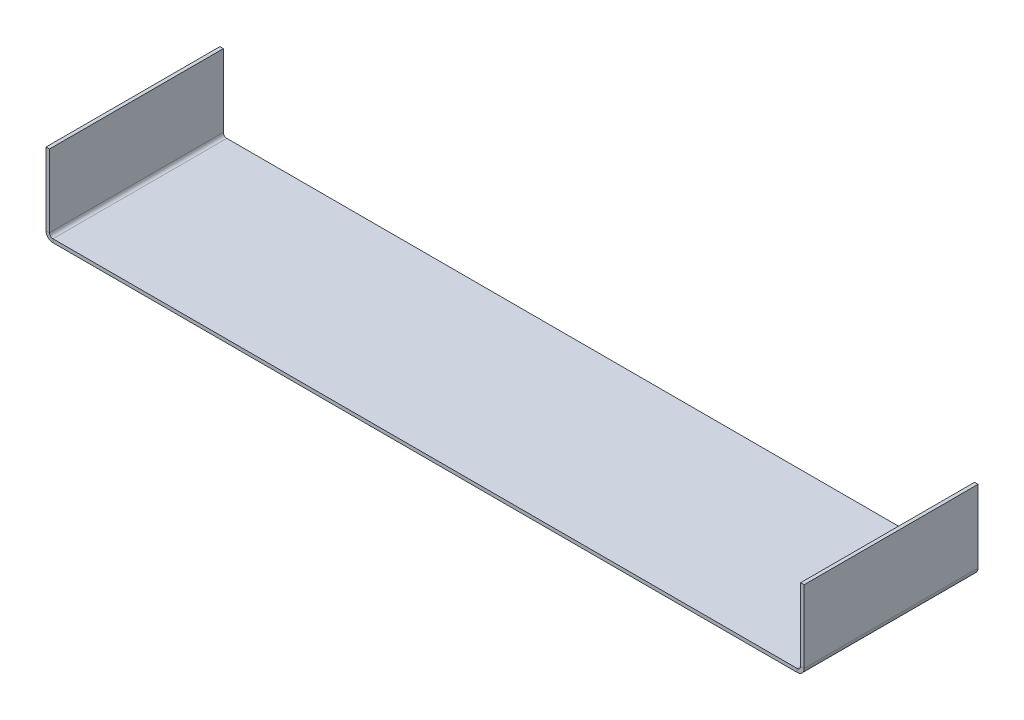
ISO-10303-21;
HEADER;
FILE_DESCRIPTION(('STEP AP214'),'2;1');
FILE_NAME('part.step','',(''),(''),'','','');
FILE_SCHEMA(('AUTOMOTIVE_DESIGN { 1 0 10303 214 1 1 1 1 }'));
ENDSEC;
DATA;
#1=APPLICATION_CONTEXT('core data for automotive mechanical design processes');
#2=APPLICATION_PROTOCOL_DEFINITION('international standard','automotive_design',2000,#1);
#3=PRODUCT_CONTEXT('',#1,'mechanical');
#4=PRODUCT('Part','Part','',(#3));
#5=PRODUCT_RELATED_PRODUCT_CATEGORY('part','',(#4));
#6=PRODUCT_DEFINITION_FORMATION('','',#4);
#7=PRODUCT_DEFINITION_CONTEXT('part definition',#1,'design');
#8=PRODUCT_DEFINITION('design','',#6,#7);
#9=PRODUCT_DEFINITION_SHAPE('','',#8);
#10=(LENGTH_UNIT() NAMED_UNIT(*) SI_UNIT(.MILLI.,.METRE.));
#11=(NAMED_UNIT(*) PLANE_ANGLE_UNIT() SI_UNIT($,.RADIAN.));
#12=(NAMED_UNIT(*) SI_UNIT($,.STERADIAN.) SOLID_ANGLE_UNIT());
#13=UNCERTAINTY_MEASURE_WITH_UNIT(LENGTH_MEASURE(1.E-05),#10,'distance_accuracy_value','');
#14=(GEOMETRIC_REPRESENTATION_CONTEXT(3) GLOBAL_UNCERTAINTY_ASSIGNED_CONTEXT((#13)) GLOBAL_UNIT_ASSIGNED_CONTEXT((#10,
#11,#12)) REPRESENTATION_CONTEXT('',''));
#15=CARTESIAN_POINT('',(0.,0.,0.));
#16=DIRECTION('',(0.,0.,1.));
#17=DIRECTION('',(1.,0.,0.));
#18=AXIS2_PLACEMENT_3D('',#15,#16,#17);
#19=CARTESIAN_POINT('',(0.,-41.7,100.));
#20=DIRECTION('',(0.,0.,1.));
#21=DIRECTION('',(1.,0.,0.));
#22=AXIS2_PLACEMENT_3D('',#19,#20,#21);
#23=PLANE('',#22);
#24=DIRECTION('',(1.,0.,0.));
#25=VECTOR('',#24,1.);
#26=CARTESIAN_POINT('',(0.,-41.7,100.));
#27=LINE('',#26,#25);
#28=CARTESIAN_POINT('',(0.,-41.7,100.));
#29=VERTEX_POINT('',#28);
#30=CARTESIAN_POINT('',(2.00000000000001,-41.7,100.));
#31=VERTEX_POINT('',#30);
#32=EDGE_CURVE('E11',#29,#31,#27,.T.);
#33=ORIENTED_EDGE('',*,*,#32,.F.);
#34=CARTESIAN_POINT('',(4.00000000000001,-41.7,100.));
#35=DIRECTION('',(0.,0.,-1.));
#36=DIRECTION('',(-1.,0.,0.));
#37=AXIS2_PLACEMENT_3D('',#34,#35,#36);
#38=CIRCLE('',#37,4.);
#39=CARTESIAN_POINT('',(4.00000000000001,-45.7,100.));
#40=VERTEX_POINT('',#39);
#41=EDGE_CURVE('E149',#29,#40,#38,.F.);
#42=ORIENTED_EDGE('',*,*,#41,.T.);
#43=DIRECTION('',(0.,-1.,0.));
#44=VECTOR('',#43,1.);
#45=CARTESIAN_POINT('',(4.00000000000001,-43.7,100.));
#46=LINE('',#45,#44);
#47=CARTESIAN_POINT('',(4.00000000000001,-43.7,100.));
#48=VERTEX_POINT('',#47);
#49=EDGE_CURVE('E47',#48,#40,#46,.T.);
#50=ORIENTED_EDGE('',*,*,#49,.F.);
#51=CARTESIAN_POINT('',(4.00000000000001,-41.7,100.));
#52=DIRECTION('',(0.,0.,1.));
#53=DIRECTION('',(1.,0.,0.));
#54=AXIS2_PLACEMENT_3D('',#51,#52,#53);
#55=CIRCLE('',#54,2.);
#56=EDGE_CURVE('E243',#31,#48,#55,.T.);
#57=ORIENTED_EDGE('',*,*,#56,.F.);
#58=EDGE_LOOP('',(#33,#42,#50,#57));
#59=FACE_BOUND('',#58,.T.);
#60=ADVANCED_FACE('F39',(#59),#23,.T.);
#61=CARTESIAN_POINT('',(4.00000000000001,-43.7,100.));
#62=DIRECTION('',(0.,0.,1.));
#63=DIRECTION('',(1.,0.,0.));
#64=AXIS2_PLACEMENT_3D('',#61,#62,#63);
#65=PLANE('',#64);
#66=DIRECTION('',(0.,-1.,0.));
#67=VECTOR('',#66,1.);
#68=CARTESIAN_POINT('',(0.,0.,100.));
#69=LINE('',#68,#67);
#70=CARTESIAN_POINT('',(0.,0.,100.));
#71=VERTEX_POINT('',#70);
#72=EDGE_CURVE('E154',#71,#29,#69,.T.);
#73=ORIENTED_EDGE('',*,*,#72,.T.);
#74=ORIENTED_EDGE('',*,*,#32,.T.);
#75=DIRECTION('',(0.,-1.,0.));
#76=VECTOR('',#75,1.);
#77=CARTESIAN_POINT('',(2.,0.,100.));
#78=LINE('',#77,#76);
#79=CARTESIAN_POINT('',(2.,0.,100.));
#80=VERTEX_POINT('',#79);
#81=EDGE_CURVE('E256',#80,#31,#78,.T.);
#82=ORIENTED_EDGE('',*,*,#81,.F.);
#83=DIRECTION('',(1.,0.,0.));
#84=VECTOR('',#83,1.);
#85=CARTESIAN_POINT('',(0.,0.,100.));
#86=LINE('',#85,#84);
#87=EDGE_CURVE('E258',#71,#80,#86,.T.);
#88=ORIENTED_EDGE('',*,*,#87,.F.);
#89=EDGE_LOOP('',(#73,#74,#82,#88));
#90=FACE_BOUND('',#89,.T.);
#91=ADVANCED_FACE('F269',(#90),#65,.T.);
#92=CARTESIAN_POINT('',(4.00000000000001,-45.7,0.));
#93=DIRECTION('',(0.,0.,-1.));
#94=DIRECTION('',(-1.,0.,0.));
#95=AXIS2_PLACEMENT_3D('',#92,#93,#94);
#96=PLANE('',#95);
#97=DIRECTION('',(0.,1.,0.));
#98=VECTOR('',#97,1.);
#99=CARTESIAN_POINT('',(4.00000000000001,-45.7,0.));
#100=LINE('',#99,#98);
#101=CARTESIAN_POINT('',(4.00000000000001,-45.7,0.));
#102=VERTEX_POINT('',#101);
#103=CARTESIAN_POINT('',(4.00000000000001,-43.7,0.));
#104=VERTEX_POINT('',#103);
#105=EDGE_CURVE('E147',#102,#104,#100,.T.);
#106=ORIENTED_EDGE('',*,*,#105,.F.);
#107=CARTESIAN_POINT('',(4.00000000000001,-41.7,0.));
#108=DIRECTION('',(0.,0.,-1.));
#109=DIRECTION('',(-1.,0.,0.));
#110=AXIS2_PLACEMENT_3D('',#107,#108,#109);
#111=CIRCLE('',#110,4.);
#112=CARTESIAN_POINT('',(0.,-41.7,0.));
#113=VERTEX_POINT('',#112);
#114=EDGE_CURVE('E161',#113,#102,#111,.F.);
#115=ORIENTED_EDGE('',*,*,#114,.F.);
#116=DIRECTION('',(-1.,0.,0.));
#117=VECTOR('',#116,1.);
#118=CARTESIAN_POINT('',(2.00000000000001,-41.7,0.));
#119=LINE('',#118,#117);
#120=CARTESIAN_POINT('',(2.00000000000001,-41.7,0.));
#121=VERTEX_POINT('',#120);
#122=EDGE_CURVE('E234',#121,#113,#119,.T.);
#123=ORIENTED_EDGE('',*,*,#122,.F.);
#124=CARTESIAN_POINT('',(4.00000000000001,-41.7,0.));
#125=DIRECTION('',(0.,0.,1.));
#126=DIRECTION('',(1.,0.,0.));
#127=AXIS2_PLACEMENT_3D('',#124,#125,#126);
#128=CIRCLE('',#127,2.);
#129=EDGE_CURVE('E188',#121,#104,#128,.T.);
#130=ORIENTED_EDGE('',*,*,#129,.T.);
#131=EDGE_LOOP('',(#106,#115,#123,#130));
#132=FACE_BOUND('',#131,.T.);
#133=ADVANCED_FACE('F248',(#132),#96,.T.);
#134=CARTESIAN_POINT('',(2.00000000000001,-41.7,0.));
#135=DIRECTION('',(0.,0.,-1.));
#136=DIRECTION('',(-1.,0.,0.));
#137=AXIS2_PLACEMENT_3D('',#134,#135,#136);
#138=PLANE('',#137);
#139=DIRECTION('',(1.,0.,0.));
#140=VECTOR('',#139,1.);
#141=CARTESIAN_POINT('',(0.,-45.7,0.));
#142=LINE('',#141,#140);
#143=CARTESIAN_POINT('',(432.,-45.7,0.));
#144=VERTEX_POINT('',#143);
#145=EDGE_CURVE('E201',#102,#144,#142,.T.);
#146=ORIENTED_EDGE('',*,*,#145,.F.);
#147=ORIENTED_EDGE('',*,*,#105,.T.);
#148=DIRECTION('',(1.,0.,0.));
#149=VECTOR('',#148,1.);
#150=CARTESIAN_POINT('',(0.,-43.7,0.));
#151=LINE('',#150,#149);
#152=CARTESIAN_POINT('',(432.,-43.7,0.));
#153=VERTEX_POINT('',#152);
#154=EDGE_CURVE('E186',#104,#153,#151,.T.);
#155=ORIENTED_EDGE('',*,*,#154,.T.);
#156=DIRECTION('',(0.,-1.,0.));
#157=VECTOR('',#156,1.);
#158=CARTESIAN_POINT('',(432.,-43.7,0.));
#159=LINE('',#158,#157);
#160=EDGE_CURVE('E96',#153,#144,#159,.T.);
#161=ORIENTED_EDGE('',*,*,#160,.T.);
#162=EDGE_LOOP('',(#146,#147,#155,#161));
#163=FACE_BOUND('',#162,.T.);
#164=ADVANCED_FACE('F236',(#163),#138,.T.);
#165=CARTESIAN_POINT('',(432.,-45.7,100.));
#166=DIRECTION('',(0.,0.,1.));
#167=DIRECTION('',(1.,0.,0.));
#168=AXIS2_PLACEMENT_3D('',#165,#166,#167);
#169=PLANE('',#168);
#170=DIRECTION('',(0.,1.,0.));
#171=VECTOR('',#170,1.);
#172=CARTESIAN_POINT('',(432.,-45.7,100.));
#173=LINE('',#172,#171);
#174=CARTESIAN_POINT('',(432.,-45.7,100.));
#175=VERTEX_POINT('',#174);
#176=CARTESIAN_POINT('',(432.,-43.7,100.));
#177=VERTEX_POINT('',#176);
#178=EDGE_CURVE('E232',#175,#177,#173,.T.);
#179=ORIENTED_EDGE('',*,*,#178,.F.);
#180=CARTESIAN_POINT('',(432.,-41.7,100.));
#181=DIRECTION('',(0.,0.,-1.));
#182=DIRECTION('',(-1.,0.,0.));
#183=AXIS2_PLACEMENT_3D('',#180,#181,#182);
#184=CIRCLE('',#183,4.);
#185=CARTESIAN_POINT('',(436.,-41.7,100.));
#186=VERTEX_POINT('',#185);
#187=EDGE_CURVE('E169',#175,#186,#184,.F.);
#188=ORIENTED_EDGE('',*,*,#187,.T.);
#189=DIRECTION('',(1.,0.,0.));
#190=VECTOR('',#189,1.);
#191=CARTESIAN_POINT('',(434.,-41.7,100.));
#192=LINE('',#191,#190);
#193=CARTESIAN_POINT('',(434.,-41.7,100.));
#194=VERTEX_POINT('',#193);
#195=EDGE_CURVE('E55',#194,#186,#192,.T.);
#196=ORIENTED_EDGE('',*,*,#195,.F.);
#197=CARTESIAN_POINT('',(432.,-41.7,100.));
#198=DIRECTION('',(0.,0.,1.));
#199=DIRECTION('',(1.,0.,0.));
#200=AXIS2_PLACEMENT_3D('',#197,#198,#199);
#201=CIRCLE('',#200,2.);
#202=EDGE_CURVE('E260',#177,#194,#201,.T.);
#203=ORIENTED_EDGE('',*,*,#202,.F.);
#204=EDGE_LOOP('',(#179,#188,#196,#203));
#205=FACE_BOUND('',#204,.T.);
#206=ADVANCED_FACE('F295',(#205),#169,.T.);
#207=CARTESIAN_POINT('',(434.,-41.7,100.));
#208=DIRECTION('',(0.,0.,1.));
#209=DIRECTION('',(1.,0.,0.));
#210=AXIS2_PLACEMENT_3D('',#207,#208,#209);
#211=PLANE('',#210);
#212=DIRECTION('',(1.,0.,0.));
#213=VECTOR('',#212,1.);
#214=CARTESIAN_POINT('',(0.,-45.7,100.));
#215=LINE('',#214,#213);
#216=EDGE_CURVE('E139',#40,#175,#215,.T.);
#217=ORIENTED_EDGE('',*,*,#216,.T.);
#218=ORIENTED_EDGE('',*,*,#178,.T.);
#219=DIRECTION('',(1.,0.,0.));
#220=VECTOR('',#219,1.);
#221=CARTESIAN_POINT('',(0.,-43.7,100.));
#222=LINE('',#221,#220);
#223=EDGE_CURVE('E142',#48,#177,#222,.T.);
#224=ORIENTED_EDGE('',*,*,#223,.F.);
#225=ORIENTED_EDGE('',*,*,#49,.T.);
#226=EDGE_LOOP('',(#217,#218,#224,#225));
#227=FACE_BOUND('',#226,.T.);
#228=ADVANCED_FACE('F137',(#227),#211,.T.);
#229=CARTESIAN_POINT('',(436.,-41.7,0.));
#230=DIRECTION('',(0.,0.,-1.));
#231=DIRECTION('',(-1.,0.,0.));
#232=AXIS2_PLACEMENT_3D('',#229,#230,#231);
#233=PLANE('',#232);
#234=DIRECTION('',(-1.,0.,0.));
#235=VECTOR('',#234,1.);
#236=CARTESIAN_POINT('',(436.,-41.7,0.));
#237=LINE('',#236,#235);
#238=CARTESIAN_POINT('',(436.,-41.7,0.));
#239=VERTEX_POINT('',#238);
#240=CARTESIAN_POINT('',(434.,-41.7,0.));
#241=VERTEX_POINT('',#240);
#242=EDGE_CURVE('E103',#239,#241,#237,.T.);
#243=ORIENTED_EDGE('',*,*,#242,.F.);
#244=CARTESIAN_POINT('',(432.,-41.7,0.));
#245=DIRECTION('',(0.,0.,-1.));
#246=DIRECTION('',(-1.,0.,0.));
#247=AXIS2_PLACEMENT_3D('',#244,#245,#246);
#248=CIRCLE('',#247,4.);
#249=EDGE_CURVE('E203',#144,#239,#248,.F.);
#250=ORIENTED_EDGE('',*,*,#249,.F.);
#251=ORIENTED_EDGE('',*,*,#160,.F.);
#252=CARTESIAN_POINT('',(432.,-41.7,0.));
#253=DIRECTION('',(0.,0.,1.));
#254=DIRECTION('',(1.,0.,0.));
#255=AXIS2_PLACEMENT_3D('',#252,#253,#254);
#256=CIRCLE('',#255,2.);
#257=EDGE_CURVE('E184',#153,#241,#256,.T.);
#258=ORIENTED_EDGE('',*,*,#257,.T.);
#259=EDGE_LOOP('',(#243,#250,#251,#258));
#260=FACE_BOUND('',#259,.T.);
#261=ADVANCED_FACE('F301',(#260),#233,.T.);
#262=CARTESIAN_POINT('',(432.,-43.7,0.));
#263=DIRECTION('',(0.,0.,-1.));
#264=DIRECTION('',(-1.,0.,0.));
#265=AXIS2_PLACEMENT_3D('',#262,#263,#264);
#266=PLANE('',#265);
#267=DIRECTION('',(0.,1.,0.));
#268=VECTOR('',#267,1.);
#269=CARTESIAN_POINT('',(436.,-45.7,0.));
#270=LINE('',#269,#268);
#271=CARTESIAN_POINT('',(436.,0.,0.));
#272=VERTEX_POINT('',#271);
#273=EDGE_CURVE('E175',#239,#272,#270,.T.);
#274=ORIENTED_EDGE('',*,*,#273,.F.);
#275=ORIENTED_EDGE('',*,*,#242,.T.);
#276=DIRECTION('',(0.,1.,0.));
#277=VECTOR('',#276,1.);
#278=CARTESIAN_POINT('',(434.,-45.7,0.));
#279=LINE('',#278,#277);
#280=CARTESIAN_POINT('',(434.,0.,0.));
#281=VERTEX_POINT('',#280);
#282=EDGE_CURVE('E181',#241,#281,#279,.T.);
#283=ORIENTED_EDGE('',*,*,#282,.T.);
#284=DIRECTION('',(1.,0.,0.));
#285=VECTOR('',#284,1.);
#286=CARTESIAN_POINT('',(434.,0.,0.));
#287=LINE('',#286,#285);
#288=EDGE_CURVE('E178',#281,#272,#287,.T.);
#289=ORIENTED_EDGE('',*,*,#288,.T.);
#290=EDGE_LOOP('',(#274,#275,#283,#289));
#291=FACE_BOUND('',#290,.T.);
#292=ADVANCED_FACE('F304',(#291),#266,.T.);
#293=CARTESIAN_POINT('',(436.,-45.7,100.));
#294=DIRECTION('',(-1.,0.,0.));
#295=DIRECTION('',(0.,0.,1.));
#296=AXIS2_PLACEMENT_3D('',#293,#294,#295);
#297=PLANE('',#296);
#298=ORIENTED_EDGE('',*,*,#273,.T.);
#299=DIRECTION('',(0.,0.,-1.));
#300=VECTOR('',#299,1.);
#301=CARTESIAN_POINT('',(436.,0.,100.));
#302=LINE('',#301,#300);
#303=CARTESIAN_POINT('',(436.,0.,100.));
#304=VERTEX_POINT('',#303);
#305=EDGE_CURVE('E227',#304,#272,#302,.T.);
#306=ORIENTED_EDGE('',*,*,#305,.F.);
#307=DIRECTION('',(0.,1.,0.));
#308=VECTOR('',#307,1.);
#309=CARTESIAN_POINT('',(436.,-45.7,100.));
#310=LINE('',#309,#308);
#311=EDGE_CURVE('E109',#186,#304,#310,.T.);
#312=ORIENTED_EDGE('',*,*,#311,.F.);
#313=DIRECTION('',(0.,0.,-1.));
#314=VECTOR('',#313,1.);
#315=CARTESIAN_POINT('',(436.,-41.7,100.));
#316=LINE('',#315,#314);
#317=EDGE_CURVE('E171',#186,#239,#316,.T.);
#318=ORIENTED_EDGE('',*,*,#317,.T.);
#319=EDGE_LOOP('',(#298,#306,#312,#318));
#320=FACE_BOUND('',#319,.T.);
#321=ADVANCED_FACE('F307',(#320),#297,.F.);
#322=CARTESIAN_POINT('',(434.,0.,100.));
#323=DIRECTION('',(0.,1.,0.));
#324=DIRECTION('',(0.,0.,1.));
#325=AXIS2_PLACEMENT_3D('',#322,#323,#324);
#326=PLANE('',#325);
#327=ORIENTED_EDGE('',*,*,#288,.F.);
#328=DIRECTION('',(0.,0.,-1.));
#329=VECTOR('',#328,1.);
#330=CARTESIAN_POINT('',(434.,0.,100.));
#331=LINE('',#330,#329);
#332=CARTESIAN_POINT('',(434.,0.,100.));
#333=VERTEX_POINT('',#332);
#334=EDGE_CURVE('E225',#333,#281,#331,.T.);
#335=ORIENTED_EDGE('',*,*,#334,.F.);
#336=DIRECTION('',(1.,0.,0.));
#337=VECTOR('',#336,1.);
#338=CARTESIAN_POINT('',(434.,0.,100.));
#339=LINE('',#338,#337);
#340=EDGE_CURVE('E515',#333,#304,#339,.T.);
#341=ORIENTED_EDGE('',*,*,#340,.T.);
#342=ORIENTED_EDGE('',*,*,#305,.T.);
#343=EDGE_LOOP('',(#327,#335,#341,#342));
#344=FACE_BOUND('',#343,.T.);
#345=ADVANCED_FACE('F311',(#344),#326,.T.);
#346=CARTESIAN_POINT('',(434.,-45.7,100.));
#347=DIRECTION('',(-1.,0.,0.));
#348=DIRECTION('',(0.,0.,1.));
#349=AXIS2_PLACEMENT_3D('',#346,#347,#348);
#350=PLANE('',#349);
#351=ORIENTED_EDGE('',*,*,#282,.F.);
#352=DIRECTION('',(0.,0.,-1.));
#353=VECTOR('',#352,1.);
#354=CARTESIAN_POINT('',(434.,-41.7,100.));
#355=LINE('',#354,#353);
#356=EDGE_CURVE('E222',#194,#241,#355,.T.);
#357=ORIENTED_EDGE('',*,*,#356,.F.);
#358=DIRECTION('',(0.,1.,0.));
#359=VECTOR('',#358,1.);
#360=CARTESIAN_POINT('',(434.,-45.7,100.));
#361=LINE('',#360,#359);
#362=EDGE_CURVE('E517',#194,#333,#361,.T.);
#363=ORIENTED_EDGE('',*,*,#362,.T.);
#364=ORIENTED_EDGE('',*,*,#334,.T.);
#365=EDGE_LOOP('',(#351,#357,#363,#364));
#366=FACE_BOUND('',#365,.T.);
#367=ADVANCED_FACE('F315',(#366),#350,.T.);
#368=CARTESIAN_POINT('',(432.,-41.7,100.));
#369=DIRECTION('',(0.,0.,-1.));
#370=DIRECTION('',(-1.,0.,0.));
#371=AXIS2_PLACEMENT_3D('',#368,#369,#370);
#372=CYLINDRICAL_SURFACE('',#371,2.);
#373=ORIENTED_EDGE('',*,*,#257,.F.);
#374=DIRECTION('',(0.,0.,-1.));
#375=VECTOR('',#374,1.);
#376=CARTESIAN_POINT('',(432.,-43.7,100.));
#377=LINE('',#376,#375);
#378=EDGE_CURVE('E219',#177,#153,#377,.T.);
#379=ORIENTED_EDGE('',*,*,#378,.F.);
#380=ORIENTED_EDGE('',*,*,#202,.T.);
#381=ORIENTED_EDGE('',*,*,#356,.T.);
#382=EDGE_LOOP('',(#373,#379,#380,#381));
#383=FACE_BOUND('',#382,.T.);
#384=ADVANCED_FACE('F319',(#383),#372,.F.);
#385=CARTESIAN_POINT('',(0.,-43.7,100.));
#386=DIRECTION('',(0.,1.,0.));
#387=DIRECTION('',(0.,0.,1.));
#388=AXIS2_PLACEMENT_3D('',#385,#386,#387);
#389=PLANE('',#388);
#390=ORIENTED_EDGE('',*,*,#154,.F.);
#391=DIRECTION('',(0.,0.,-1.));
#392=VECTOR('',#391,1.);
#393=CARTESIAN_POINT('',(4.00000000000001,-43.7,100.));
#394=LINE('',#393,#392);
#395=EDGE_CURVE('E216',#48,#104,#394,.T.);
#396=ORIENTED_EDGE('',*,*,#395,.F.);
#397=ORIENTED_EDGE('',*,*,#223,.T.);
#398=ORIENTED_EDGE('',*,*,#378,.T.);
#399=EDGE_LOOP('',(#390,#396,#397,#398));
#400=FACE_BOUND('',#399,.T.);
#401=ADVANCED_FACE('F245',(#400),#389,.T.);
#402=CARTESIAN_POINT('',(4.00000000000001,-41.7,100.));
#403=DIRECTION('',(0.,0.,-1.));
#404=DIRECTION('',(-1.,0.,0.));
#405=AXIS2_PLACEMENT_3D('',#402,#403,#404);
#406=CYLINDRICAL_SURFACE('',#405,2.);
#407=ORIENTED_EDGE('',*,*,#129,.F.);
#408=DIRECTION('',(0.,0.,-1.));
#409=VECTOR('',#408,1.);
#410=CARTESIAN_POINT('',(2.00000000000001,-41.7,100.));
#411=LINE('',#410,#409);
#412=EDGE_CURVE('E213',#31,#121,#411,.T.);
#413=ORIENTED_EDGE('',*,*,#412,.F.);
#414=ORIENTED_EDGE('',*,*,#56,.T.);
#415=ORIENTED_EDGE('',*,*,#395,.T.);
#416=EDGE_LOOP('',(#407,#413,#414,#415));
#417=FACE_BOUND('',#416,.T.);
#418=ADVANCED_FACE('F241',(#417),#406,.F.);
#419=CARTESIAN_POINT('',(2.,0.,100.));
#420=DIRECTION('',(1.,0.,0.));
#421=DIRECTION('',(0.,1.,0.));
#422=AXIS2_PLACEMENT_3D('',#419,#420,#421);
#423=PLANE('',#422);
#424=DIRECTION('',(0.,-1.,0.));
#425=VECTOR('',#424,1.);
#426=CARTESIAN_POINT('',(2.,0.,0.));
#427=LINE('',#426,#425);
#428=CARTESIAN_POINT('',(2.,0.,0.));
#429=VERTEX_POINT('',#428);
#430=EDGE_CURVE('E191',#429,#121,#427,.T.);
#431=ORIENTED_EDGE('',*,*,#430,.F.);
#432=DIRECTION('',(0.,0.,-1.));
#433=VECTOR('',#432,1.);
#434=CARTESIAN_POINT('',(2.,0.,100.));
#435=LINE('',#434,#433);
#436=EDGE_CURVE('E211',#80,#429,#435,.T.);
#437=ORIENTED_EDGE('',*,*,#436,.F.);
#438=ORIENTED_EDGE('',*,*,#81,.T.);
#439=ORIENTED_EDGE('',*,*,#412,.T.);
#440=EDGE_LOOP('',(#431,#437,#438,#439));
#441=FACE_BOUND('',#440,.T.);
#442=ADVANCED_FACE('F254',(#441),#423,.T.);
#443=CARTESIAN_POINT('',(0.,0.,100.));
#444=DIRECTION('',(0.,1.,0.));
#445=DIRECTION('',(-1.,0.,0.));
#446=AXIS2_PLACEMENT_3D('',#443,#444,#445);
#447=PLANE('',#446);
#448=DIRECTION('',(1.,0.,0.));
#449=VECTOR('',#448,1.);
#450=CARTESIAN_POINT('',(0.,0.,0.));
#451=LINE('',#450,#449);
#452=CARTESIAN_POINT('',(0.,0.,0.));
#453=VERTEX_POINT('',#452);
#454=EDGE_CURVE('E194',#453,#429,#451,.T.);
#455=ORIENTED_EDGE('',*,*,#454,.F.);
#456=DIRECTION('',(0.,0.,-1.));
#457=VECTOR('',#456,1.);
#458=CARTESIAN_POINT('',(0.,0.,100.));
#459=LINE('',#458,#457);
#460=EDGE_CURVE('E209',#71,#453,#459,.T.);
#461=ORIENTED_EDGE('',*,*,#460,.F.);
#462=ORIENTED_EDGE('',*,*,#87,.T.);
#463=ORIENTED_EDGE('',*,*,#436,.T.);
#464=EDGE_LOOP('',(#455,#461,#462,#463));
#465=FACE_BOUND('',#464,.T.);
#466=ADVANCED_FACE('F275',(#465),#447,.T.);
#467=CARTESIAN_POINT('',(0.,0.,100.));
#468=DIRECTION('',(1.,0.,0.));
#469=DIRECTION('',(0.,1.,0.));
#470=AXIS2_PLACEMENT_3D('',#467,#468,#469);
#471=PLANE('',#470);
#472=DIRECTION('',(0.,-1.,0.));
#473=VECTOR('',#472,1.);
#474=CARTESIAN_POINT('',(0.,0.,0.));
#475=LINE('',#474,#473);
#476=EDGE_CURVE('E197',#453,#113,#475,.T.);
#477=ORIENTED_EDGE('',*,*,#476,.T.);
#478=DIRECTION('',(0.,0.,-1.));
#479=VECTOR('',#478,1.);
#480=CARTESIAN_POINT('',(0.,-41.7,100.));
#481=LINE('',#480,#479);
#482=EDGE_CURVE('E163',#29,#113,#481,.T.);
#483=ORIENTED_EDGE('',*,*,#482,.F.);
#484=ORIENTED_EDGE('',*,*,#72,.F.);
#485=ORIENTED_EDGE('',*,*,#460,.T.);
#486=EDGE_LOOP('',(#477,#483,#484,#485));
#487=FACE_BOUND('',#486,.T.);
#488=ADVANCED_FACE('F271',(#487),#471,.F.);
#489=CARTESIAN_POINT('',(4.00000000000001,-41.7,100.));
#490=DIRECTION('',(0.,0.,-1.));
#491=DIRECTION('',(-1.,0.,0.));
#492=AXIS2_PLACEMENT_3D('',#489,#490,#491);
#493=CYLINDRICAL_SURFACE('',#492,4.);
#494=ORIENTED_EDGE('',*,*,#114,.T.);
#495=DIRECTION('',(0.,0.,-1.));
#496=VECTOR('',#495,1.);
#497=CARTESIAN_POINT('',(4.00000000000001,-45.7,100.));
#498=LINE('',#497,#496);
#499=EDGE_CURVE('E158',#40,#102,#498,.T.);
#500=ORIENTED_EDGE('',*,*,#499,.F.);
#501=ORIENTED_EDGE('',*,*,#41,.F.);
#502=ORIENTED_EDGE('',*,*,#482,.T.);
#503=EDGE_LOOP('',(#494,#500,#501,#502));
#504=FACE_BOUND('',#503,.T.);
#505=ADVANCED_FACE('F159',(#504),#493,.T.);
#506=CARTESIAN_POINT('',(0.,-45.7,100.));
#507=DIRECTION('',(0.,1.,0.));
#508=DIRECTION('',(0.,0.,1.));
#509=AXIS2_PLACEMENT_3D('',#506,#507,#508);
#510=PLANE('',#509);
#511=ORIENTED_EDGE('',*,*,#145,.T.);
#512=DIRECTION('',(0.,0.,-1.));
#513=VECTOR('',#512,1.);
#514=CARTESIAN_POINT('',(432.,-45.7,100.));
#515=LINE('',#514,#513);
#516=EDGE_CURVE('E164',#175,#144,#515,.T.);
#517=ORIENTED_EDGE('',*,*,#516,.F.);
#518=ORIENTED_EDGE('',*,*,#216,.F.);
#519=ORIENTED_EDGE('',*,*,#499,.T.);
#520=EDGE_LOOP('',(#511,#517,#518,#519));
#521=FACE_BOUND('',#520,.T.);
#522=ADVANCED_FACE('F166',(#521),#510,.F.);
#523=CARTESIAN_POINT('',(432.,-41.7,100.));
#524=DIRECTION('',(0.,0.,-1.));
#525=DIRECTION('',(-1.,0.,0.));
#526=AXIS2_PLACEMENT_3D('',#523,#524,#525);
#527=CYLINDRICAL_SURFACE('',#526,4.);
#528=ORIENTED_EDGE('',*,*,#249,.T.);
#529=ORIENTED_EDGE('',*,*,#317,.F.);
#530=ORIENTED_EDGE('',*,*,#187,.F.);
#531=ORIENTED_EDGE('',*,*,#516,.T.);
#532=EDGE_LOOP('',(#528,#529,#530,#531));
#533=FACE_BOUND('',#532,.T.);
#534=ADVANCED_FACE('F366',(#533),#527,.T.);
#535=CARTESIAN_POINT('',(432.,-41.7,100.));
#536=DIRECTION('',(0.,0.,1.));
#537=DIRECTION('',(1.,0.,0.));
#538=AXIS2_PLACEMENT_3D('',#535,#536,#537);
#539=PLANE('',#538);
#540=ORIENTED_EDGE('',*,*,#311,.T.);
#541=ORIENTED_EDGE('',*,*,#340,.F.);
#542=ORIENTED_EDGE('',*,*,#362,.F.);
#543=ORIENTED_EDGE('',*,*,#195,.T.);
#544=EDGE_LOOP('',(#540,#541,#542,#543));
#545=FACE_BOUND('',#544,.T.);
#546=ADVANCED_FACE('F376',(#545),#539,.T.);
#547=CARTESIAN_POINT('',(432.,-41.7,0.));
#548=DIRECTION('',(0.,0.,1.));
#549=DIRECTION('',(1.,0.,0.));
#550=AXIS2_PLACEMENT_3D('',#547,#548,#549);
#551=PLANE('',#550);
#552=ORIENTED_EDGE('',*,*,#430,.T.);
#553=ORIENTED_EDGE('',*,*,#122,.T.);
#554=ORIENTED_EDGE('',*,*,#476,.F.);
#555=ORIENTED_EDGE('',*,*,#454,.T.);
#556=EDGE_LOOP('',(#552,#553,#554,#555));
#557=FACE_BOUND('',#556,.T.);
#558=ADVANCED_FACE('F273',(#557),#551,.F.);
#559=CLOSED_SHELL('',(#60,#91,#133,#164,#206,#228,#261,#292,#321,#345,#367,#384,#401,#418,#442,
#466,#488,#505,#522,#534,#546,#558));
#560=MANIFOLD_SOLID_BREP('B2',#559);
#561=ADVANCED_BREP_SHAPE_REPRESENTATION('',(#18,#560),#14);
#562=SHAPE_DEFINITION_REPRESENTATION(#9,#561);
ENDSEC;
END-ISO-10303-21;
